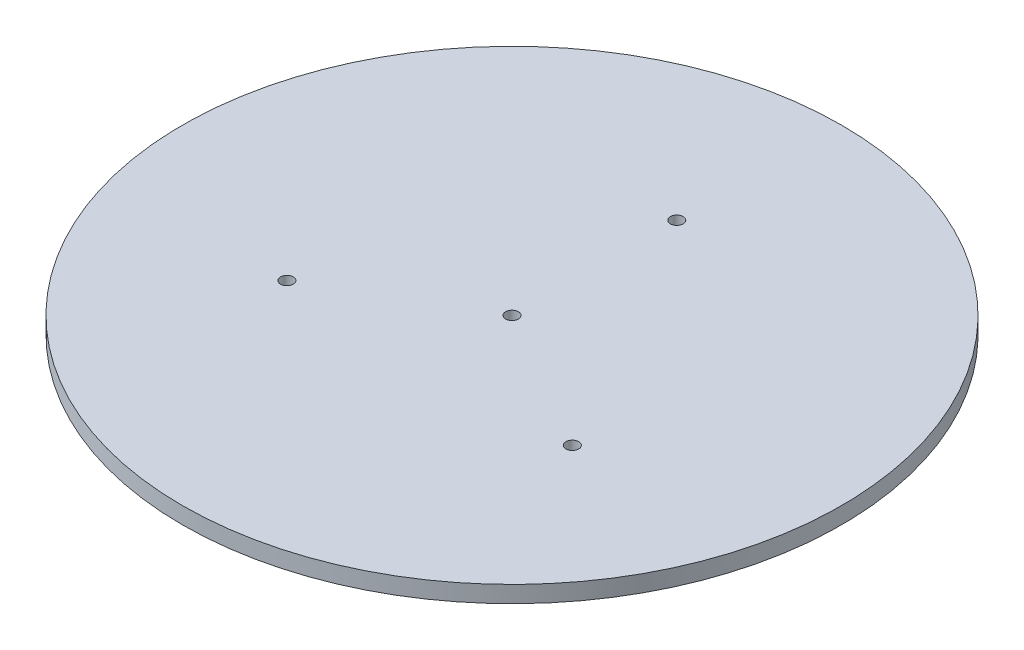
ISO-10303-21;
HEADER;
FILE_DESCRIPTION(('STEP AP214'),'2;1');
FILE_NAME('part.step','',(''),(''),'','','');
FILE_SCHEMA(('AUTOMOTIVE_DESIGN { 1 0 10303 214 1 1 1 1 }'));
ENDSEC;
DATA;
#1=APPLICATION_CONTEXT('core data for automotive mechanical design processes');
#2=APPLICATION_PROTOCOL_DEFINITION('international standard','automotive_design',2000,#1);
#3=PRODUCT_CONTEXT('',#1,'mechanical');
#4=PRODUCT('Part','Part','',(#3));
#5=PRODUCT_RELATED_PRODUCT_CATEGORY('part','',(#4));
#6=PRODUCT_DEFINITION_FORMATION('','',#4);
#7=PRODUCT_DEFINITION_CONTEXT('part definition',#1,'design');
#8=PRODUCT_DEFINITION('design','',#6,#7);
#9=PRODUCT_DEFINITION_SHAPE('','',#8);
#10=(LENGTH_UNIT() NAMED_UNIT(*) SI_UNIT(.MILLI.,.METRE.));
#11=(NAMED_UNIT(*) PLANE_ANGLE_UNIT() SI_UNIT($,.RADIAN.));
#12=(NAMED_UNIT(*) SI_UNIT($,.STERADIAN.) SOLID_ANGLE_UNIT());
#13=UNCERTAINTY_MEASURE_WITH_UNIT(LENGTH_MEASURE(1.E-05),#10,'distance_accuracy_value','');
#14=(GEOMETRIC_REPRESENTATION_CONTEXT(3) GLOBAL_UNCERTAINTY_ASSIGNED_CONTEXT((#13)) GLOBAL_UNIT_ASSIGNED_CONTEXT((#10,
#11,#12)) REPRESENTATION_CONTEXT('',''));
#15=CARTESIAN_POINT('',(0.,0.,0.));
#16=DIRECTION('',(0.,0.,1.));
#17=DIRECTION('',(1.,0.,0.));
#18=AXIS2_PLACEMENT_3D('',#15,#16,#17);
#19=CARTESIAN_POINT('',(0.,6.35,0.));
#20=DIRECTION('',(0.,1.,0.));
#21=DIRECTION('',(0.,0.,1.));
#22=AXIS2_PLACEMENT_3D('',#19,#20,#21);
#23=PLANE('',#22);
#24=CARTESIAN_POINT('',(54.2914573227729,6.35,31.3451875));
#25=DIRECTION('',(0.,1.,0.));
#26=DIRECTION('',(0.,0.,1.));
#27=AXIS2_PLACEMENT_3D('',#24,#25,#26);
#28=CIRCLE('',#27,2.4257);
#29=CARTESIAN_POINT('',(54.2914573227729,6.35,33.7708875));
#30=VERTEX_POINT('',#29);
#31=EDGE_CURVE('E53',#30,#30,#28,.T.);
#32=ORIENTED_EDGE('',*,*,#31,.F.);
#33=EDGE_LOOP('',(#32));
#34=FACE_BOUND('',#33,.T.);
#35=CARTESIAN_POINT('',(0.,6.35,-62.690375));
#36=DIRECTION('',(0.,1.,0.));
#37=DIRECTION('',(0.,0.,1.));
#38=AXIS2_PLACEMENT_3D('',#35,#36,#37);
#39=CIRCLE('',#38,2.4257);
#40=CARTESIAN_POINT('',(0.,6.35,-60.264675));
#41=VERTEX_POINT('',#40);
#42=EDGE_CURVE('E42',#41,#41,#39,.T.);
#43=ORIENTED_EDGE('',*,*,#42,.F.);
#44=EDGE_LOOP('',(#43));
#45=FACE_BOUND('',#44,.T.);
#46=CARTESIAN_POINT('',(0.,6.35,0.));
#47=DIRECTION('',(0.,1.,0.));
#48=DIRECTION('',(0.,0.,1.));
#49=AXIS2_PLACEMENT_3D('',#46,#47,#48);
#50=CIRCLE('',#49,125.38075);
#51=CARTESIAN_POINT('',(0.,6.35,125.38075));
#52=VERTEX_POINT('',#51);
#53=EDGE_CURVE('E10',#52,#52,#50,.T.);
#54=ORIENTED_EDGE('',*,*,#53,.T.);
#55=EDGE_LOOP('',(#54));
#56=FACE_BOUND('',#55,.T.);
#57=CARTESIAN_POINT('',(0.,6.35,0.));
#58=DIRECTION('',(0.,1.,0.));
#59=DIRECTION('',(0.,0.,1.));
#60=AXIS2_PLACEMENT_3D('',#57,#58,#59);
#61=CIRCLE('',#60,2.4257);
#62=CARTESIAN_POINT('',(0.,6.35,2.4257));
#63=VERTEX_POINT('',#62);
#64=EDGE_CURVE('E47',#63,#63,#61,.T.);
#65=ORIENTED_EDGE('',*,*,#64,.F.);
#66=EDGE_LOOP('',(#65));
#67=FACE_BOUND('',#66,.T.);
#68=CARTESIAN_POINT('',(-54.2914573227729,6.35,31.3451875));
#69=DIRECTION('',(0.,1.,0.));
#70=DIRECTION('',(0.,0.,1.));
#71=AXIS2_PLACEMENT_3D('',#68,#69,#70);
#72=CIRCLE('',#71,2.4257);
#73=CARTESIAN_POINT('',(-54.2914573227729,6.35,33.7708875));
#74=VERTEX_POINT('',#73);
#75=EDGE_CURVE('E59',#74,#74,#72,.T.);
#76=ORIENTED_EDGE('',*,*,#75,.F.);
#77=EDGE_LOOP('',(#76));
#78=FACE_BOUND('',#77,.T.);
#79=ADVANCED_FACE('F31',(#34,#45,#56,#67,#78),#23,.T.);
#80=CARTESIAN_POINT('',(0.,0.,0.));
#81=DIRECTION('',(0.,1.,0.));
#82=DIRECTION('',(0.,0.,1.));
#83=AXIS2_PLACEMENT_3D('',#80,#81,#82);
#84=PLANE('',#83);
#85=CARTESIAN_POINT('',(54.2914573227729,0.,31.3451875));
#86=DIRECTION('',(0.,1.,0.));
#87=DIRECTION('',(0.,0.,1.));
#88=AXIS2_PLACEMENT_3D('',#85,#86,#87);
#89=CIRCLE('',#88,2.4257);
#90=CARTESIAN_POINT('',(54.2914573227729,0.,33.7708875));
#91=VERTEX_POINT('',#90);
#92=EDGE_CURVE('E56',#91,#91,#89,.T.);
#93=ORIENTED_EDGE('',*,*,#92,.T.);
#94=EDGE_LOOP('',(#93));
#95=FACE_BOUND('',#94,.T.);
#96=CARTESIAN_POINT('',(0.,0.,-62.690375));
#97=DIRECTION('',(0.,1.,0.));
#98=DIRECTION('',(0.,0.,1.));
#99=AXIS2_PLACEMENT_3D('',#96,#97,#98);
#100=CIRCLE('',#99,2.4257);
#101=CARTESIAN_POINT('',(0.,0.,-60.264675));
#102=VERTEX_POINT('',#101);
#103=EDGE_CURVE('E44',#102,#102,#100,.T.);
#104=ORIENTED_EDGE('',*,*,#103,.T.);
#105=EDGE_LOOP('',(#104));
#106=FACE_BOUND('',#105,.T.);
#107=CARTESIAN_POINT('',(0.,0.,0.));
#108=DIRECTION('',(0.,1.,0.));
#109=DIRECTION('',(0.,0.,1.));
#110=AXIS2_PLACEMENT_3D('',#107,#108,#109);
#111=CIRCLE('',#110,125.38075);
#112=CARTESIAN_POINT('',(0.,0.,125.38075));
#113=VERTEX_POINT('',#112);
#114=EDGE_CURVE('E35',#113,#113,#111,.T.);
#115=ORIENTED_EDGE('',*,*,#114,.F.);
#116=EDGE_LOOP('',(#115));
#117=FACE_BOUND('',#116,.T.);
#118=CARTESIAN_POINT('',(0.,0.,0.));
#119=DIRECTION('',(0.,1.,0.));
#120=DIRECTION('',(0.,0.,1.));
#121=AXIS2_PLACEMENT_3D('',#118,#119,#120);
#122=CIRCLE('',#121,2.4257);
#123=CARTESIAN_POINT('',(0.,0.,2.4257));
#124=VERTEX_POINT('',#123);
#125=EDGE_CURVE('E50',#124,#124,#122,.T.);
#126=ORIENTED_EDGE('',*,*,#125,.T.);
#127=EDGE_LOOP('',(#126));
#128=FACE_BOUND('',#127,.T.);
#129=CARTESIAN_POINT('',(-54.2914573227729,0.,31.3451875));
#130=DIRECTION('',(0.,1.,0.));
#131=DIRECTION('',(0.,0.,1.));
#132=AXIS2_PLACEMENT_3D('',#129,#130,#131);
#133=CIRCLE('',#132,2.4257);
#134=CARTESIAN_POINT('',(-54.2914573227729,0.,33.7708875));
#135=VERTEX_POINT('',#134);
#136=EDGE_CURVE('E62',#135,#135,#133,.T.);
#137=ORIENTED_EDGE('',*,*,#136,.T.);
#138=EDGE_LOOP('',(#137));
#139=FACE_BOUND('',#138,.T.);
#140=ADVANCED_FACE('F72',(#95,#106,#117,#128,#139),#84,.F.);
#141=CARTESIAN_POINT('',(0.,6.35,0.));
#142=DIRECTION('',(0.,-1.,0.));
#143=DIRECTION('',(0.,0.,-1.));
#144=AXIS2_PLACEMENT_3D('',#141,#142,#143);
#145=CYLINDRICAL_SURFACE('',#144,125.38075);
#146=ORIENTED_EDGE('',*,*,#53,.F.);
#147=EDGE_LOOP('',(#146));
#148=FACE_BOUND('',#147,.T.);
#149=ORIENTED_EDGE('',*,*,#114,.T.);
#150=EDGE_LOOP('',(#149));
#151=FACE_BOUND('',#150,.T.);
#152=ADVANCED_FACE('F33',(#148,#151),#145,.T.);
#153=CARTESIAN_POINT('',(0.,6.35,-62.690375));
#154=DIRECTION('',(0.,-1.,0.));
#155=DIRECTION('',(0.,0.,-1.));
#156=AXIS2_PLACEMENT_3D('',#153,#154,#155);
#157=CYLINDRICAL_SURFACE('',#156,2.4257);
#158=ORIENTED_EDGE('',*,*,#42,.T.);
#159=EDGE_LOOP('',(#158));
#160=FACE_BOUND('',#159,.T.);
#161=ORIENTED_EDGE('',*,*,#103,.F.);
#162=EDGE_LOOP('',(#161));
#163=FACE_BOUND('',#162,.T.);
#164=ADVANCED_FACE('F82',(#160,#163),#157,.F.);
#165=CARTESIAN_POINT('',(0.,6.35,0.));
#166=DIRECTION('',(0.,-1.,0.));
#167=DIRECTION('',(0.,0.,-1.));
#168=AXIS2_PLACEMENT_3D('',#165,#166,#167);
#169=CYLINDRICAL_SURFACE('',#168,2.4257);
#170=ORIENTED_EDGE('',*,*,#64,.T.);
#171=EDGE_LOOP('',(#170));
#172=FACE_BOUND('',#171,.T.);
#173=ORIENTED_EDGE('',*,*,#125,.F.);
#174=EDGE_LOOP('',(#173));
#175=FACE_BOUND('',#174,.T.);
#176=ADVANCED_FACE('F85',(#172,#175),#169,.F.);
#177=CARTESIAN_POINT('',(54.2914573227729,6.35,31.3451875));
#178=DIRECTION('',(0.,-1.,0.));
#179=DIRECTION('',(0.,0.,-1.));
#180=AXIS2_PLACEMENT_3D('',#177,#178,#179);
#181=CYLINDRICAL_SURFACE('',#180,2.4257);
#182=ORIENTED_EDGE('',*,*,#31,.T.);
#183=EDGE_LOOP('',(#182));
#184=FACE_BOUND('',#183,.T.);
#185=ORIENTED_EDGE('',*,*,#92,.F.);
#186=EDGE_LOOP('',(#185));
#187=FACE_BOUND('',#186,.T.);
#188=ADVANCED_FACE('F89',(#184,#187),#181,.F.);
#189=CARTESIAN_POINT('',(-54.2914573227729,6.35,31.3451875));
#190=DIRECTION('',(0.,-1.,0.));
#191=DIRECTION('',(0.,0.,-1.));
#192=AXIS2_PLACEMENT_3D('',#189,#190,#191);
#193=CYLINDRICAL_SURFACE('',#192,2.4257);
#194=ORIENTED_EDGE('',*,*,#75,.T.);
#195=EDGE_LOOP('',(#194));
#196=FACE_BOUND('',#195,.T.);
#197=ORIENTED_EDGE('',*,*,#136,.F.);
#198=EDGE_LOOP('',(#197));
#199=FACE_BOUND('',#198,.T.);
#200=ADVANCED_FACE('F68',(#196,#199),#193,.F.);
#201=CLOSED_SHELL('',(#79,#140,#152,#164,#176,#188,#200));
#202=MANIFOLD_SOLID_BREP('B2',#201);
#203=ADVANCED_BREP_SHAPE_REPRESENTATION('',(#18,#202),#14);
#204=SHAPE_DEFINITION_REPRESENTATION(#9,#203);
ENDSEC;
END-ISO-10303-21;
